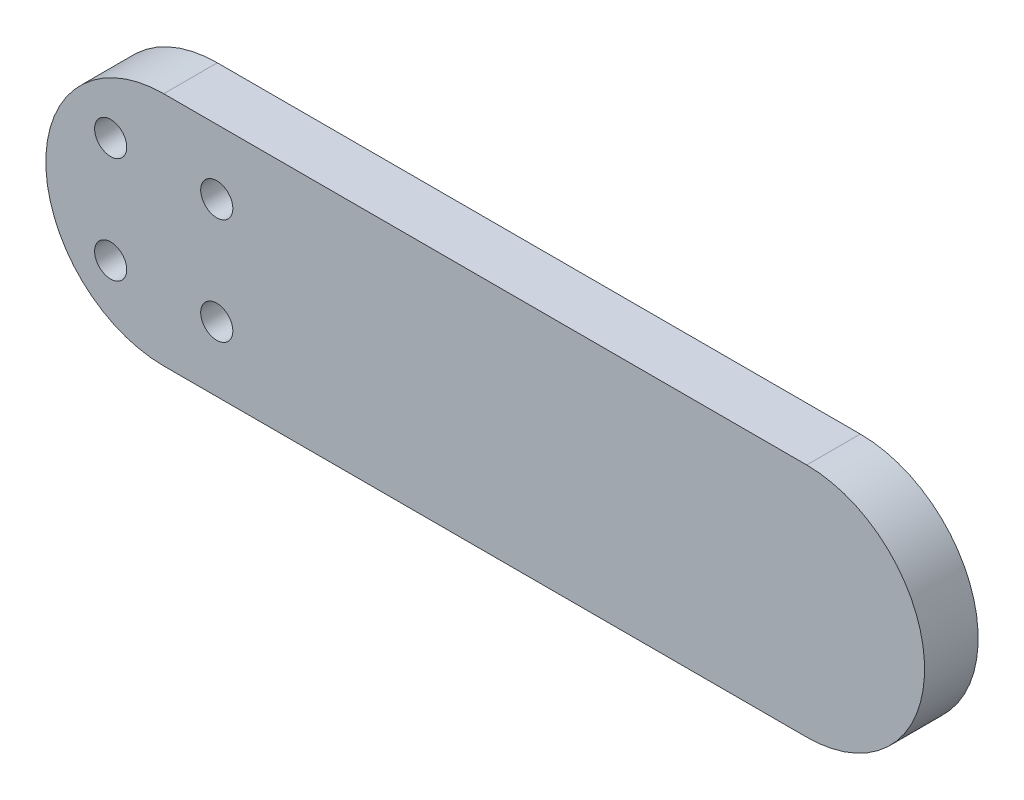
ISO-10303-21;
HEADER;
FILE_DESCRIPTION(('STEP AP214'),'2;1');
FILE_NAME('part.step','',(''),(''),'','','');
FILE_SCHEMA(('AUTOMOTIVE_DESIGN { 1 0 10303 214 1 1 1 1 }'));
ENDSEC;
DATA;
#1=APPLICATION_CONTEXT('core data for automotive mechanical design processes');
#2=APPLICATION_PROTOCOL_DEFINITION('international standard','automotive_design',2000,#1);
#3=PRODUCT_CONTEXT('',#1,'mechanical');
#4=PRODUCT('Part','Part','',(#3));
#5=PRODUCT_RELATED_PRODUCT_CATEGORY('part','',(#4));
#6=PRODUCT_DEFINITION_FORMATION('','',#4);
#7=PRODUCT_DEFINITION_CONTEXT('part definition',#1,'design');
#8=PRODUCT_DEFINITION('design','',#6,#7);
#9=PRODUCT_DEFINITION_SHAPE('','',#8);
#10=(LENGTH_UNIT() NAMED_UNIT(*) SI_UNIT(.MILLI.,.METRE.));
#11=(NAMED_UNIT(*) PLANE_ANGLE_UNIT() SI_UNIT($,.RADIAN.));
#12=(NAMED_UNIT(*) SI_UNIT($,.STERADIAN.) SOLID_ANGLE_UNIT());
#13=UNCERTAINTY_MEASURE_WITH_UNIT(LENGTH_MEASURE(1.E-05),#10,'distance_accuracy_value','');
#14=(GEOMETRIC_REPRESENTATION_CONTEXT(3) GLOBAL_UNCERTAINTY_ASSIGNED_CONTEXT((#13)) GLOBAL_UNIT_ASSIGNED_CONTEXT((#10,
#11,#12)) REPRESENTATION_CONTEXT('',''));
#15=CARTESIAN_POINT('',(0.,0.,0.));
#16=DIRECTION('',(0.,0.,1.));
#17=DIRECTION('',(1.,0.,0.));
#18=AXIS2_PLACEMENT_3D('',#15,#16,#17);
#19=CARTESIAN_POINT('',(0.,0.,5.));
#20=DIRECTION('',(0.,0.,1.));
#21=DIRECTION('',(1.,0.,0.));
#22=AXIS2_PLACEMENT_3D('',#19,#20,#21);
#23=PLANE('',#22);
#24=CARTESIAN_POINT('',(4.94974746830581,-4.94974746830586,5.));
#25=DIRECTION('',(0.,0.,1.));
#26=DIRECTION('',(1.,0.,0.));
#27=AXIS2_PLACEMENT_3D('',#24,#25,#26);
#28=CIRCLE('',#27,1.5);
#29=CARTESIAN_POINT('',(6.44974746830581,-4.94974746830586,5.));
#30=VERTEX_POINT('',#29);
#31=EDGE_CURVE('E125',#30,#30,#28,.T.);
#32=ORIENTED_EDGE('',*,*,#31,.F.);
#33=EDGE_LOOP('',(#32));
#34=FACE_BOUND('',#33,.T.);
#35=CARTESIAN_POINT('',(-4.94974746830584,4.94974746830582,5.));
#36=DIRECTION('',(0.,0.,1.));
#37=DIRECTION('',(1.,0.,0.));
#38=AXIS2_PLACEMENT_3D('',#35,#36,#37);
#39=CIRCLE('',#38,1.5);
#40=CARTESIAN_POINT('',(-3.44974746830584,4.94974746830582,5.));
#41=VERTEX_POINT('',#40);
#42=EDGE_CURVE('E104',#41,#41,#39,.T.);
#43=ORIENTED_EDGE('',*,*,#42,.F.);
#44=EDGE_LOOP('',(#43));
#45=FACE_BOUND('',#44,.T.);
#46=CARTESIAN_POINT('',(0.,0.,5.));
#47=DIRECTION('',(0.,0.,1.));
#48=DIRECTION('',(1.,0.,0.));
#49=AXIS2_PLACEMENT_3D('',#46,#47,#48);
#50=CIRCLE('',#49,11.);
#51=CARTESIAN_POINT('',(0.,11.,5.));
#52=VERTEX_POINT('',#51);
#53=CARTESIAN_POINT('',(0.,-11.,5.));
#54=VERTEX_POINT('',#53);
#55=EDGE_CURVE('E89',#52,#54,#50,.T.);
#56=ORIENTED_EDGE('',*,*,#55,.T.);
#57=DIRECTION('',(1.,0.,0.));
#58=VECTOR('',#57,1.);
#59=CARTESIAN_POINT('',(0.,-11.,5.));
#60=LINE('',#59,#58);
#61=CARTESIAN_POINT('',(60.,-11.,5.));
#62=VERTEX_POINT('',#61);
#63=EDGE_CURVE('E84',#54,#62,#60,.T.);
#64=ORIENTED_EDGE('',*,*,#63,.T.);
#65=CARTESIAN_POINT('',(60.,0.,5.));
#66=DIRECTION('',(0.,0.,1.));
#67=DIRECTION('',(1.,0.,0.));
#68=AXIS2_PLACEMENT_3D('',#65,#66,#67);
#69=CIRCLE('',#68,11.);
#70=CARTESIAN_POINT('',(60.,11.,5.));
#71=VERTEX_POINT('',#70);
#72=EDGE_CURVE('E87',#62,#71,#69,.T.);
#73=ORIENTED_EDGE('',*,*,#72,.T.);
#74=DIRECTION('',(-1.,0.,0.));
#75=VECTOR('',#74,1.);
#76=CARTESIAN_POINT('',(0.,11.,5.));
#77=LINE('',#76,#75);
#78=EDGE_CURVE('E54',#71,#52,#77,.T.);
#79=ORIENTED_EDGE('',*,*,#78,.T.);
#80=EDGE_LOOP('',(#56,#64,#73,#79));
#81=FACE_BOUND('',#80,.T.);
#82=CARTESIAN_POINT('',(4.94974746830584,4.94974746830582,5.));
#83=DIRECTION('',(0.,0.,1.));
#84=DIRECTION('',(1.,0.,0.));
#85=AXIS2_PLACEMENT_3D('',#82,#83,#84);
#86=CIRCLE('',#85,1.5);
#87=CARTESIAN_POINT('',(6.44974746830584,4.94974746830582,5.));
#88=VERTEX_POINT('',#87);
#89=EDGE_CURVE('E119',#88,#88,#86,.T.);
#90=ORIENTED_EDGE('',*,*,#89,.F.);
#91=EDGE_LOOP('',(#90));
#92=FACE_BOUND('',#91,.T.);
#93=CARTESIAN_POINT('',(-4.94974746830588,-4.94974746830579,5.));
#94=DIRECTION('',(0.,0.,1.));
#95=DIRECTION('',(1.,0.,0.));
#96=AXIS2_PLACEMENT_3D('',#93,#94,#95);
#97=CIRCLE('',#96,1.5);
#98=CARTESIAN_POINT('',(-3.44974746830587,-4.94974746830579,5.));
#99=VERTEX_POINT('',#98);
#100=EDGE_CURVE('E131',#99,#99,#97,.T.);
#101=ORIENTED_EDGE('',*,*,#100,.F.);
#102=EDGE_LOOP('',(#101));
#103=FACE_BOUND('',#102,.T.);
#104=ADVANCED_FACE('F37',(#34,#45,#81,#92,#103),#23,.T.);
#105=CARTESIAN_POINT('',(0.,0.,0.));
#106=DIRECTION('',(0.,0.,1.));
#107=DIRECTION('',(1.,0.,0.));
#108=AXIS2_PLACEMENT_3D('',#105,#106,#107);
#109=PLANE('',#108);
#110=CARTESIAN_POINT('',(0.,0.,0.));
#111=DIRECTION('',(0.,0.,1.));
#112=DIRECTION('',(1.,0.,0.));
#113=AXIS2_PLACEMENT_3D('',#110,#111,#112);
#114=CIRCLE('',#113,11.);
#115=CARTESIAN_POINT('',(0.,11.,0.));
#116=VERTEX_POINT('',#115);
#117=CARTESIAN_POINT('',(0.,-11.,0.));
#118=VERTEX_POINT('',#117);
#119=EDGE_CURVE('E101',#116,#118,#114,.T.);
#120=ORIENTED_EDGE('',*,*,#119,.F.);
#121=DIRECTION('',(-1.,0.,0.));
#122=VECTOR('',#121,1.);
#123=CARTESIAN_POINT('',(0.,11.,0.));
#124=LINE('',#123,#122);
#125=CARTESIAN_POINT('',(60.,11.,0.));
#126=VERTEX_POINT('',#125);
#127=EDGE_CURVE('E77',#126,#116,#124,.T.);
#128=ORIENTED_EDGE('',*,*,#127,.F.);
#129=CARTESIAN_POINT('',(60.,0.,0.));
#130=DIRECTION('',(0.,0.,1.));
#131=DIRECTION('',(1.,0.,0.));
#132=AXIS2_PLACEMENT_3D('',#129,#130,#131);
#133=CIRCLE('',#132,11.);
#134=CARTESIAN_POINT('',(60.,-11.,0.));
#135=VERTEX_POINT('',#134);
#136=EDGE_CURVE('E71',#135,#126,#133,.T.);
#137=ORIENTED_EDGE('',*,*,#136,.F.);
#138=DIRECTION('',(1.,0.,0.));
#139=VECTOR('',#138,1.);
#140=CARTESIAN_POINT('',(0.,-11.,0.));
#141=LINE('',#140,#139);
#142=EDGE_CURVE('E93',#118,#135,#141,.T.);
#143=ORIENTED_EDGE('',*,*,#142,.F.);
#144=EDGE_LOOP('',(#120,#128,#137,#143));
#145=FACE_BOUND('',#144,.T.);
#146=CARTESIAN_POINT('',(-4.94974746830584,4.94974746830582,0.));
#147=DIRECTION('',(0.,0.,1.));
#148=DIRECTION('',(1.,0.,0.));
#149=AXIS2_PLACEMENT_3D('',#146,#147,#148);
#150=CIRCLE('',#149,1.5);
#151=CARTESIAN_POINT('',(-3.44974746830584,4.94974746830582,0.));
#152=VERTEX_POINT('',#151);
#153=EDGE_CURVE('E116',#152,#152,#150,.T.);
#154=ORIENTED_EDGE('',*,*,#153,.T.);
#155=EDGE_LOOP('',(#154));
#156=FACE_BOUND('',#155,.T.);
#157=CARTESIAN_POINT('',(4.94974746830584,4.94974746830582,0.));
#158=DIRECTION('',(0.,0.,1.));
#159=DIRECTION('',(1.,0.,0.));
#160=AXIS2_PLACEMENT_3D('',#157,#158,#159);
#161=CIRCLE('',#160,1.5);
#162=CARTESIAN_POINT('',(6.44974746830584,4.94974746830582,0.));
#163=VERTEX_POINT('',#162);
#164=EDGE_CURVE('E122',#163,#163,#161,.T.);
#165=ORIENTED_EDGE('',*,*,#164,.T.);
#166=EDGE_LOOP('',(#165));
#167=FACE_BOUND('',#166,.T.);
#168=CARTESIAN_POINT('',(4.94974746830581,-4.94974746830586,0.));
#169=DIRECTION('',(0.,0.,1.));
#170=DIRECTION('',(1.,0.,0.));
#171=AXIS2_PLACEMENT_3D('',#168,#169,#170);
#172=CIRCLE('',#171,1.5);
#173=CARTESIAN_POINT('',(6.44974746830581,-4.94974746830586,0.));
#174=VERTEX_POINT('',#173);
#175=EDGE_CURVE('E128',#174,#174,#172,.T.);
#176=ORIENTED_EDGE('',*,*,#175,.T.);
#177=EDGE_LOOP('',(#176));
#178=FACE_BOUND('',#177,.T.);
#179=CARTESIAN_POINT('',(-4.94974746830588,-4.94974746830579,0.));
#180=DIRECTION('',(0.,0.,1.));
#181=DIRECTION('',(1.,0.,0.));
#182=AXIS2_PLACEMENT_3D('',#179,#180,#181);
#183=CIRCLE('',#182,1.5);
#184=CARTESIAN_POINT('',(-3.44974746830587,-4.94974746830579,0.));
#185=VERTEX_POINT('',#184);
#186=EDGE_CURVE('E134',#185,#185,#183,.T.);
#187=ORIENTED_EDGE('',*,*,#186,.T.);
#188=EDGE_LOOP('',(#187));
#189=FACE_BOUND('',#188,.T.);
#190=ADVANCED_FACE('F112',(#145,#156,#167,#178,#189),#109,.F.);
#191=CARTESIAN_POINT('',(0.,0.,5.));
#192=DIRECTION('',(0.,0.,-1.));
#193=DIRECTION('',(-1.,0.,0.));
#194=AXIS2_PLACEMENT_3D('',#191,#192,#193);
#195=CYLINDRICAL_SURFACE('',#194,11.);
#196=ORIENTED_EDGE('',*,*,#119,.T.);
#197=DIRECTION('',(0.,0.,-1.));
#198=VECTOR('',#197,1.);
#199=CARTESIAN_POINT('',(0.,-11.,5.));
#200=LINE('',#199,#198);
#201=EDGE_CURVE('E11',#54,#118,#200,.T.);
#202=ORIENTED_EDGE('',*,*,#201,.F.);
#203=ORIENTED_EDGE('',*,*,#55,.F.);
#204=DIRECTION('',(0.,0.,-1.));
#205=VECTOR('',#204,1.);
#206=CARTESIAN_POINT('',(0.,11.,5.));
#207=LINE('',#206,#205);
#208=EDGE_CURVE('E97',#52,#116,#207,.T.);
#209=ORIENTED_EDGE('',*,*,#208,.T.);
#210=EDGE_LOOP('',(#196,#202,#203,#209));
#211=FACE_BOUND('',#210,.T.);
#212=ADVANCED_FACE('F39',(#211),#195,.T.);
#213=CARTESIAN_POINT('',(0.,-11.,5.));
#214=DIRECTION('',(0.,1.,0.));
#215=DIRECTION('',(0.,0.,1.));
#216=AXIS2_PLACEMENT_3D('',#213,#214,#215);
#217=PLANE('',#216);
#218=ORIENTED_EDGE('',*,*,#142,.T.);
#219=DIRECTION('',(0.,0.,-1.));
#220=VECTOR('',#219,1.);
#221=CARTESIAN_POINT('',(60.,-11.,5.));
#222=LINE('',#221,#220);
#223=EDGE_CURVE('E46',#62,#135,#222,.T.);
#224=ORIENTED_EDGE('',*,*,#223,.F.);
#225=ORIENTED_EDGE('',*,*,#63,.F.);
#226=ORIENTED_EDGE('',*,*,#201,.T.);
#227=EDGE_LOOP('',(#218,#224,#225,#226));
#228=FACE_BOUND('',#227,.T.);
#229=ADVANCED_FACE('F92',(#228),#217,.F.);
#230=CARTESIAN_POINT('',(60.,0.,5.));
#231=DIRECTION('',(0.,0.,-1.));
#232=DIRECTION('',(-1.,0.,0.));
#233=AXIS2_PLACEMENT_3D('',#230,#231,#232);
#234=CYLINDRICAL_SURFACE('',#233,11.);
#235=ORIENTED_EDGE('',*,*,#136,.T.);
#236=DIRECTION('',(0.,0.,-1.));
#237=VECTOR('',#236,1.);
#238=CARTESIAN_POINT('',(60.,11.,5.));
#239=LINE('',#238,#237);
#240=EDGE_CURVE('E94',#71,#126,#239,.T.);
#241=ORIENTED_EDGE('',*,*,#240,.F.);
#242=ORIENTED_EDGE('',*,*,#72,.F.);
#243=ORIENTED_EDGE('',*,*,#223,.T.);
#244=EDGE_LOOP('',(#235,#241,#242,#243));
#245=FACE_BOUND('',#244,.T.);
#246=ADVANCED_FACE('F95',(#245),#234,.T.);
#247=CARTESIAN_POINT('',(0.,11.,5.));
#248=DIRECTION('',(0.,-1.,0.));
#249=DIRECTION('',(0.,0.,-1.));
#250=AXIS2_PLACEMENT_3D('',#247,#248,#249);
#251=PLANE('',#250);
#252=ORIENTED_EDGE('',*,*,#127,.T.);
#253=ORIENTED_EDGE('',*,*,#208,.F.);
#254=ORIENTED_EDGE('',*,*,#78,.F.);
#255=ORIENTED_EDGE('',*,*,#240,.T.);
#256=EDGE_LOOP('',(#252,#253,#254,#255));
#257=FACE_BOUND('',#256,.T.);
#258=ADVANCED_FACE('F109',(#257),#251,.F.);
#259=CARTESIAN_POINT('',(-4.94974746830584,4.94974746830582,5.));
#260=DIRECTION('',(0.,0.,-1.));
#261=DIRECTION('',(-1.,0.,0.));
#262=AXIS2_PLACEMENT_3D('',#259,#260,#261);
#263=CYLINDRICAL_SURFACE('',#262,1.5);
#264=ORIENTED_EDGE('',*,*,#42,.T.);
#265=EDGE_LOOP('',(#264));
#266=FACE_BOUND('',#265,.T.);
#267=ORIENTED_EDGE('',*,*,#153,.F.);
#268=EDGE_LOOP('',(#267));
#269=FACE_BOUND('',#268,.T.);
#270=ADVANCED_FACE('F153',(#266,#269),#263,.F.);
#271=CARTESIAN_POINT('',(4.94974746830584,4.94974746830582,5.));
#272=DIRECTION('',(0.,0.,-1.));
#273=DIRECTION('',(-1.,0.,0.));
#274=AXIS2_PLACEMENT_3D('',#271,#272,#273);
#275=CYLINDRICAL_SURFACE('',#274,1.5);
#276=ORIENTED_EDGE('',*,*,#89,.T.);
#277=EDGE_LOOP('',(#276));
#278=FACE_BOUND('',#277,.T.);
#279=ORIENTED_EDGE('',*,*,#164,.F.);
#280=EDGE_LOOP('',(#279));
#281=FACE_BOUND('',#280,.T.);
#282=ADVANCED_FACE('F207',(#278,#281),#275,.F.);
#283=CARTESIAN_POINT('',(4.94974746830581,-4.94974746830586,5.));
#284=DIRECTION('',(0.,0.,-1.));
#285=DIRECTION('',(-1.,0.,0.));
#286=AXIS2_PLACEMENT_3D('',#283,#284,#285);
#287=CYLINDRICAL_SURFACE('',#286,1.5);
#288=ORIENTED_EDGE('',*,*,#31,.T.);
#289=EDGE_LOOP('',(#288));
#290=FACE_BOUND('',#289,.T.);
#291=ORIENTED_EDGE('',*,*,#175,.F.);
#292=EDGE_LOOP('',(#291));
#293=FACE_BOUND('',#292,.T.);
#294=ADVANCED_FACE('F216',(#290,#293),#287,.F.);
#295=CARTESIAN_POINT('',(-4.94974746830588,-4.94974746830579,5.));
#296=DIRECTION('',(0.,0.,-1.));
#297=DIRECTION('',(-1.,0.,0.));
#298=AXIS2_PLACEMENT_3D('',#295,#296,#297);
#299=CYLINDRICAL_SURFACE('',#298,1.5);
#300=ORIENTED_EDGE('',*,*,#100,.T.);
#301=EDGE_LOOP('',(#300));
#302=FACE_BOUND('',#301,.T.);
#303=ORIENTED_EDGE('',*,*,#186,.F.);
#304=EDGE_LOOP('',(#303));
#305=FACE_BOUND('',#304,.T.);
#306=ADVANCED_FACE('F140',(#302,#305),#299,.F.);
#307=CLOSED_SHELL('',(#104,#190,#212,#229,#246,#258,#270,#282,#294,#306));
#308=MANIFOLD_SOLID_BREP('B2',#307);
#309=ADVANCED_BREP_SHAPE_REPRESENTATION('',(#18,#308),#14);
#310=SHAPE_DEFINITION_REPRESENTATION(#9,#309);
ENDSEC;
END-ISO-10303-21;
